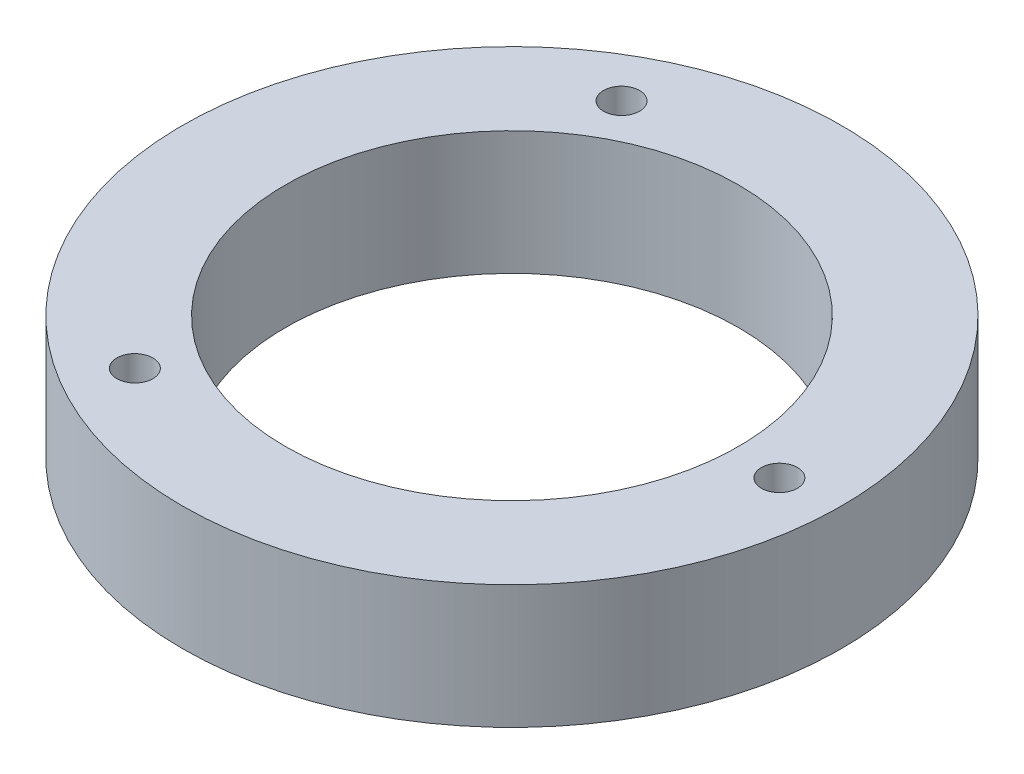
ISO-10303-21;
HEADER;
FILE_DESCRIPTION(('STEP AP214'),'2;1');
FILE_NAME('part.step','',(''),(''),'','','');
FILE_SCHEMA(('AUTOMOTIVE_DESIGN { 1 0 10303 214 1 1 1 1 }'));
ENDSEC;
DATA;
#1=APPLICATION_CONTEXT('core data for automotive mechanical design processes');
#2=APPLICATION_PROTOCOL_DEFINITION('international standard','automotive_design',2000,#1);
#3=PRODUCT_CONTEXT('',#1,'mechanical');
#4=PRODUCT('Part','Part','',(#3));
#5=PRODUCT_RELATED_PRODUCT_CATEGORY('part','',(#4));
#6=PRODUCT_DEFINITION_FORMATION('','',#4);
#7=PRODUCT_DEFINITION_CONTEXT('part definition',#1,'design');
#8=PRODUCT_DEFINITION('design','',#6,#7);
#9=PRODUCT_DEFINITION_SHAPE('','',#8);
#10=(LENGTH_UNIT() NAMED_UNIT(*) SI_UNIT(.MILLI.,.METRE.));
#11=(NAMED_UNIT(*) PLANE_ANGLE_UNIT() SI_UNIT($,.RADIAN.));
#12=(NAMED_UNIT(*) SI_UNIT($,.STERADIAN.) SOLID_ANGLE_UNIT());
#13=UNCERTAINTY_MEASURE_WITH_UNIT(LENGTH_MEASURE(1.E-05),#10,'distance_accuracy_value','');
#14=(GEOMETRIC_REPRESENTATION_CONTEXT(3) GLOBAL_UNCERTAINTY_ASSIGNED_CONTEXT((#13)) GLOBAL_UNIT_ASSIGNED_CONTEXT((#10,
#11,#12)) REPRESENTATION_CONTEXT('',''));
#15=CARTESIAN_POINT('',(0.,0.,0.));
#16=DIRECTION('',(0.,0.,1.));
#17=DIRECTION('',(1.,0.,0.));
#18=AXIS2_PLACEMENT_3D('',#15,#16,#17);
#19=CARTESIAN_POINT('',(0.,12.,0.));
#20=DIRECTION('',(0.,1.,0.));
#21=DIRECTION('',(0.,0.,1.));
#22=AXIS2_PLACEMENT_3D('',#19,#20,#21);
#23=PLANE('',#22);
#24=CARTESIAN_POINT('',(-13.8804059781114,12.,22.7308286712175));
#25=DIRECTION('',(0.,1.,0.));
#26=DIRECTION('',(0.,0.,1.));
#27=AXIS2_PLACEMENT_3D('',#24,#25,#26);
#28=CIRCLE('',#27,1.75);
#29=CARTESIAN_POINT('',(-13.8804059781114,12.,24.4808286712175));
#30=VERTEX_POINT('',#29);
#31=EDGE_CURVE('E53',#30,#30,#28,.T.);
#32=ORIENTED_EDGE('',*,*,#31,.F.);
#33=EDGE_LOOP('',(#32));
#34=FACE_BOUND('',#33,.T.);
#35=CARTESIAN_POINT('',(0.,12.,0.));
#36=DIRECTION('',(0.,1.,0.));
#37=DIRECTION('',(0.,0.,1.));
#38=AXIS2_PLACEMENT_3D('',#35,#36,#37);
#39=CIRCLE('',#38,22.);
#40=CARTESIAN_POINT('',(0.,12.,22.));
#41=VERTEX_POINT('',#40);
#42=EDGE_CURVE('E42',#41,#41,#39,.T.);
#43=ORIENTED_EDGE('',*,*,#42,.F.);
#44=EDGE_LOOP('',(#43));
#45=FACE_BOUND('',#44,.T.);
#46=CARTESIAN_POINT('',(0.,12.,0.));
#47=DIRECTION('',(0.,1.,0.));
#48=DIRECTION('',(0.,0.,1.));
#49=AXIS2_PLACEMENT_3D('',#46,#47,#48);
#50=CIRCLE('',#49,32.);
#51=CARTESIAN_POINT('',(0.,12.,32.));
#52=VERTEX_POINT('',#51);
#53=EDGE_CURVE('E10',#52,#52,#50,.T.);
#54=ORIENTED_EDGE('',*,*,#53,.T.);
#55=EDGE_LOOP('',(#54));
#56=FACE_BOUND('',#55,.T.);
#57=CARTESIAN_POINT('',(26.6256780674017,12.,0.655369856276959));
#58=DIRECTION('',(0.,1.,0.));
#59=DIRECTION('',(0.,0.,1.));
#60=AXIS2_PLACEMENT_3D('',#57,#58,#59);
#61=CIRCLE('',#60,1.75);
#62=CARTESIAN_POINT('',(26.6256780674017,12.,2.40536985627696));
#63=VERTEX_POINT('',#62);
#64=EDGE_CURVE('E47',#63,#63,#61,.T.);
#65=ORIENTED_EDGE('',*,*,#64,.F.);
#66=EDGE_LOOP('',(#65));
#67=FACE_BOUND('',#66,.T.);
#68=CARTESIAN_POINT('',(-12.7452720892902,12.,-23.3861985274946));
#69=DIRECTION('',(0.,1.,0.));
#70=DIRECTION('',(0.,0.,1.));
#71=AXIS2_PLACEMENT_3D('',#68,#69,#70);
#72=CIRCLE('',#71,1.75);
#73=CARTESIAN_POINT('',(-12.7452720892902,12.,-21.6361985274946));
#74=VERTEX_POINT('',#73);
#75=EDGE_CURVE('E59',#74,#74,#72,.T.);
#76=ORIENTED_EDGE('',*,*,#75,.F.);
#77=EDGE_LOOP('',(#76));
#78=FACE_BOUND('',#77,.T.);
#79=ADVANCED_FACE('F31',(#34,#45,#56,#67,#78),#23,.T.);
#80=CARTESIAN_POINT('',(0.,0.,0.));
#81=DIRECTION('',(0.,1.,0.));
#82=DIRECTION('',(0.,0.,1.));
#83=AXIS2_PLACEMENT_3D('',#80,#81,#82);
#84=PLANE('',#83);
#85=CARTESIAN_POINT('',(0.,0.,0.));
#86=DIRECTION('',(0.,1.,0.));
#87=DIRECTION('',(0.,0.,1.));
#88=AXIS2_PLACEMENT_3D('',#85,#86,#87);
#89=CIRCLE('',#88,32.);
#90=CARTESIAN_POINT('',(0.,0.,32.));
#91=VERTEX_POINT('',#90);
#92=EDGE_CURVE('E35',#91,#91,#89,.T.);
#93=ORIENTED_EDGE('',*,*,#92,.F.);
#94=EDGE_LOOP('',(#93));
#95=FACE_BOUND('',#94,.T.);
#96=CARTESIAN_POINT('',(0.,0.,0.));
#97=DIRECTION('',(0.,1.,0.));
#98=DIRECTION('',(0.,0.,1.));
#99=AXIS2_PLACEMENT_3D('',#96,#97,#98);
#100=CIRCLE('',#99,22.);
#101=CARTESIAN_POINT('',(0.,0.,22.));
#102=VERTEX_POINT('',#101);
#103=EDGE_CURVE('E44',#102,#102,#100,.T.);
#104=ORIENTED_EDGE('',*,*,#103,.T.);
#105=EDGE_LOOP('',(#104));
#106=FACE_BOUND('',#105,.T.);
#107=CARTESIAN_POINT('',(26.6256780674017,0.,0.655369856276959));
#108=DIRECTION('',(0.,1.,0.));
#109=DIRECTION('',(0.,0.,1.));
#110=AXIS2_PLACEMENT_3D('',#107,#108,#109);
#111=CIRCLE('',#110,1.75);
#112=CARTESIAN_POINT('',(26.6256780674017,0.,2.40536985627696));
#113=VERTEX_POINT('',#112);
#114=EDGE_CURVE('E50',#113,#113,#111,.T.);
#115=ORIENTED_EDGE('',*,*,#114,.T.);
#116=EDGE_LOOP('',(#115));
#117=FACE_BOUND('',#116,.T.);
#118=CARTESIAN_POINT('',(-13.8804059781114,0.,22.7308286712175));
#119=DIRECTION('',(0.,1.,0.));
#120=DIRECTION('',(0.,0.,1.));
#121=AXIS2_PLACEMENT_3D('',#118,#119,#120);
#122=CIRCLE('',#121,1.75);
#123=CARTESIAN_POINT('',(-13.8804059781114,0.,24.4808286712175));
#124=VERTEX_POINT('',#123);
#125=EDGE_CURVE('E56',#124,#124,#122,.T.);
#126=ORIENTED_EDGE('',*,*,#125,.T.);
#127=EDGE_LOOP('',(#126));
#128=FACE_BOUND('',#127,.T.);
#129=CARTESIAN_POINT('',(-12.7452720892902,0.,-23.3861985274946));
#130=DIRECTION('',(0.,1.,0.));
#131=DIRECTION('',(0.,0.,1.));
#132=AXIS2_PLACEMENT_3D('',#129,#130,#131);
#133=CIRCLE('',#132,1.75);
#134=CARTESIAN_POINT('',(-12.7452720892902,0.,-21.6361985274946));
#135=VERTEX_POINT('',#134);
#136=EDGE_CURVE('E62',#135,#135,#133,.T.);
#137=ORIENTED_EDGE('',*,*,#136,.T.);
#138=EDGE_LOOP('',(#137));
#139=FACE_BOUND('',#138,.T.);
#140=ADVANCED_FACE('F72',(#95,#106,#117,#128,#139),#84,.F.);
#141=CARTESIAN_POINT('',(0.,12.,0.));
#142=DIRECTION('',(0.,-1.,0.));
#143=DIRECTION('',(0.,0.,-1.));
#144=AXIS2_PLACEMENT_3D('',#141,#142,#143);
#145=CYLINDRICAL_SURFACE('',#144,32.);
#146=ORIENTED_EDGE('',*,*,#53,.F.);
#147=EDGE_LOOP('',(#146));
#148=FACE_BOUND('',#147,.T.);
#149=ORIENTED_EDGE('',*,*,#92,.T.);
#150=EDGE_LOOP('',(#149));
#151=FACE_BOUND('',#150,.T.);
#152=ADVANCED_FACE('F33',(#148,#151),#145,.T.);
#153=CARTESIAN_POINT('',(0.,12.,0.));
#154=DIRECTION('',(0.,-1.,0.));
#155=DIRECTION('',(0.,0.,-1.));
#156=AXIS2_PLACEMENT_3D('',#153,#154,#155);
#157=CYLINDRICAL_SURFACE('',#156,22.);
#158=ORIENTED_EDGE('',*,*,#42,.T.);
#159=EDGE_LOOP('',(#158));
#160=FACE_BOUND('',#159,.T.);
#161=ORIENTED_EDGE('',*,*,#103,.F.);
#162=EDGE_LOOP('',(#161));
#163=FACE_BOUND('',#162,.T.);
#164=ADVANCED_FACE('F82',(#160,#163),#157,.F.);
#165=CARTESIAN_POINT('',(26.6256780674017,12.,0.655369856276959));
#166=DIRECTION('',(0.,-1.,0.));
#167=DIRECTION('',(0.,0.,-1.));
#168=AXIS2_PLACEMENT_3D('',#165,#166,#167);
#169=CYLINDRICAL_SURFACE('',#168,1.75);
#170=ORIENTED_EDGE('',*,*,#64,.T.);
#171=EDGE_LOOP('',(#170));
#172=FACE_BOUND('',#171,.T.);
#173=ORIENTED_EDGE('',*,*,#114,.F.);
#174=EDGE_LOOP('',(#173));
#175=FACE_BOUND('',#174,.T.);
#176=ADVANCED_FACE('F85',(#172,#175),#169,.F.);
#177=CARTESIAN_POINT('',(-13.8804059781114,12.,22.7308286712175));
#178=DIRECTION('',(0.,-1.,0.));
#179=DIRECTION('',(0.,0.,-1.));
#180=AXIS2_PLACEMENT_3D('',#177,#178,#179);
#181=CYLINDRICAL_SURFACE('',#180,1.75);
#182=ORIENTED_EDGE('',*,*,#31,.T.);
#183=EDGE_LOOP('',(#182));
#184=FACE_BOUND('',#183,.T.);
#185=ORIENTED_EDGE('',*,*,#125,.F.);
#186=EDGE_LOOP('',(#185));
#187=FACE_BOUND('',#186,.T.);
#188=ADVANCED_FACE('F89',(#184,#187),#181,.F.);
#189=CARTESIAN_POINT('',(-12.7452720892902,12.,-23.3861985274946));
#190=DIRECTION('',(0.,-1.,0.));
#191=DIRECTION('',(0.,0.,-1.));
#192=AXIS2_PLACEMENT_3D('',#189,#190,#191);
#193=CYLINDRICAL_SURFACE('',#192,1.75);
#194=ORIENTED_EDGE('',*,*,#75,.T.);
#195=EDGE_LOOP('',(#194));
#196=FACE_BOUND('',#195,.T.);
#197=ORIENTED_EDGE('',*,*,#136,.F.);
#198=EDGE_LOOP('',(#197));
#199=FACE_BOUND('',#198,.T.);
#200=ADVANCED_FACE('F68',(#196,#199),#193,.F.);
#201=CLOSED_SHELL('',(#79,#140,#152,#164,#176,#188,#200));
#202=MANIFOLD_SOLID_BREP('B2',#201);
#203=ADVANCED_BREP_SHAPE_REPRESENTATION('',(#18,#202),#14);
#204=SHAPE_DEFINITION_REPRESENTATION(#9,#203);
ENDSEC;
END-ISO-10303-21;
